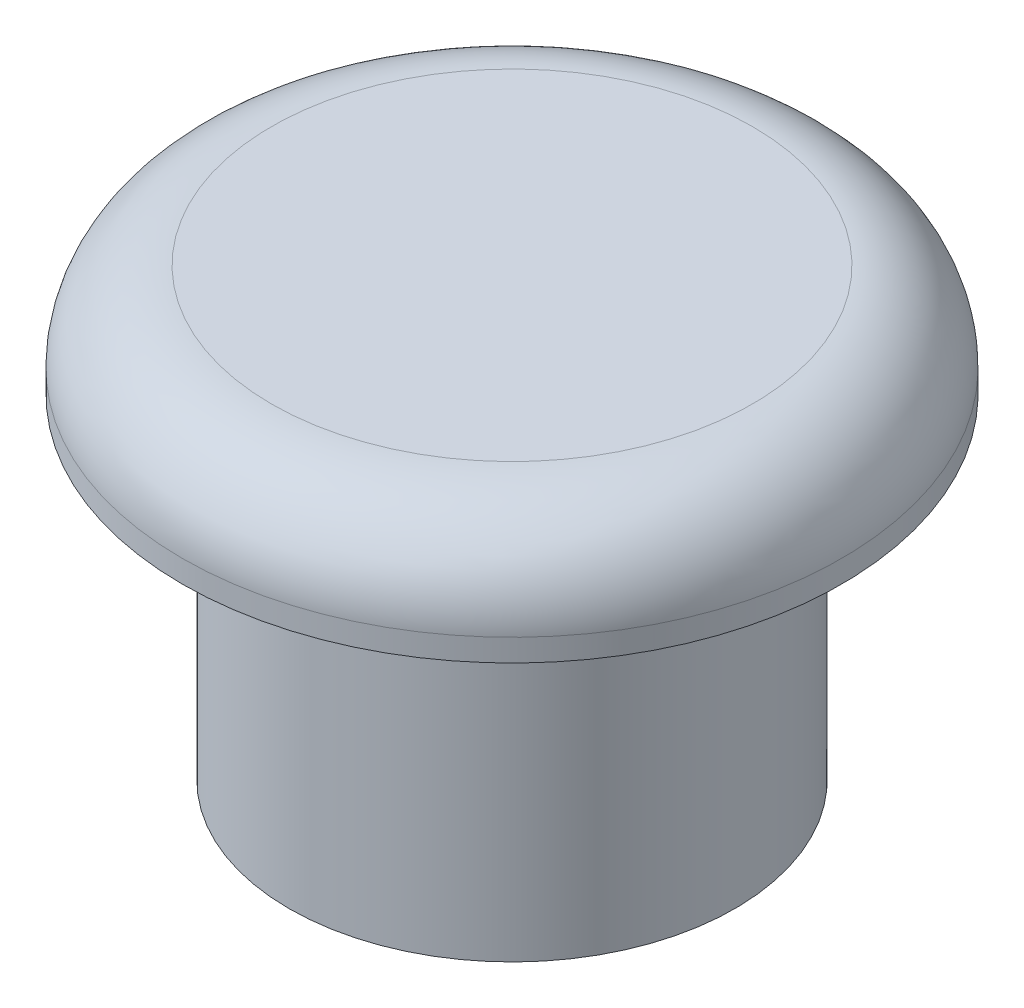
ISO-10303-21;
HEADER;
FILE_DESCRIPTION(('STEP AP214'),'2;1');
FILE_NAME('part.step','',(''),(''),'','','');
FILE_SCHEMA(('AUTOMOTIVE_DESIGN { 1 0 10303 214 1 1 1 1 }'));
ENDSEC;
DATA;
#1=APPLICATION_CONTEXT('core data for automotive mechanical design processes');
#2=APPLICATION_PROTOCOL_DEFINITION('international standard','automotive_design',2000,#1);
#3=PRODUCT_CONTEXT('',#1,'mechanical');
#4=PRODUCT('Part','Part','',(#3));
#5=PRODUCT_RELATED_PRODUCT_CATEGORY('part','',(#4));
#6=PRODUCT_DEFINITION_FORMATION('','',#4);
#7=PRODUCT_DEFINITION_CONTEXT('part definition',#1,'design');
#8=PRODUCT_DEFINITION('design','',#6,#7);
#9=PRODUCT_DEFINITION_SHAPE('','',#8);
#10=(LENGTH_UNIT() NAMED_UNIT(*) SI_UNIT(.MILLI.,.METRE.));
#11=(NAMED_UNIT(*) PLANE_ANGLE_UNIT() SI_UNIT($,.RADIAN.));
#12=(NAMED_UNIT(*) SI_UNIT($,.STERADIAN.) SOLID_ANGLE_UNIT());
#13=UNCERTAINTY_MEASURE_WITH_UNIT(LENGTH_MEASURE(1.E-05),#10,'distance_accuracy_value','');
#14=(GEOMETRIC_REPRESENTATION_CONTEXT(3) GLOBAL_UNCERTAINTY_ASSIGNED_CONTEXT((#13)) GLOBAL_UNIT_ASSIGNED_CONTEXT((#10,
#11,#12)) REPRESENTATION_CONTEXT('',''));
#15=CARTESIAN_POINT('',(0.,0.,0.));
#16=DIRECTION('',(0.,0.,1.));
#17=DIRECTION('',(1.,0.,0.));
#18=AXIS2_PLACEMENT_3D('',#15,#16,#17);
#19=CARTESIAN_POINT('',(0.,3.,0.));
#20=DIRECTION('',(0.,-1.,0.));
#21=DIRECTION('',(0.,0.,-1.));
#22=AXIS2_PLACEMENT_3D('',#19,#20,#21);
#23=CYLINDRICAL_SURFACE('',#22,2.);
#24=CARTESIAN_POINT('',(0.,3.,0.));
#25=DIRECTION('',(0.,1.,0.));
#26=DIRECTION('',(0.,0.,1.));
#27=AXIS2_PLACEMENT_3D('',#24,#25,#26);
#28=CIRCLE('',#27,2.);
#29=CARTESIAN_POINT('',(0.,3.,2.));
#30=VERTEX_POINT('',#29);
#31=EDGE_CURVE('E46',#30,#30,#28,.T.);
#32=ORIENTED_EDGE('',*,*,#31,.F.);
#33=EDGE_LOOP('',(#32));
#34=FACE_BOUND('',#33,.T.);
#35=CARTESIAN_POINT('',(0.,0.,0.));
#36=DIRECTION('',(0.,1.,0.));
#37=DIRECTION('',(0.,0.,1.));
#38=AXIS2_PLACEMENT_3D('',#35,#36,#37);
#39=CIRCLE('',#38,2.);
#40=CARTESIAN_POINT('',(0.,0.,2.));
#41=VERTEX_POINT('',#40);
#42=EDGE_CURVE('E50',#41,#41,#39,.T.);
#43=ORIENTED_EDGE('',*,*,#42,.T.);
#44=EDGE_LOOP('',(#43));
#45=FACE_BOUND('',#44,.T.);
#46=ADVANCED_FACE('F35',(#34,#45),#23,.T.);
#47=CARTESIAN_POINT('',(0.,0.,0.));
#48=DIRECTION('',(0.,1.,0.));
#49=DIRECTION('',(0.,0.,1.));
#50=AXIS2_PLACEMENT_3D('',#47,#48,#49);
#51=PLANE('',#50);
#52=ORIENTED_EDGE('',*,*,#42,.F.);
#53=EDGE_LOOP('',(#52));
#54=FACE_BOUND('',#53,.T.);
#55=ADVANCED_FACE('F76',(#54),#51,.F.);
#56=CARTESIAN_POINT('',(0.,4.,0.));
#57=DIRECTION('',(0.,-1.,0.));
#58=DIRECTION('',(0.,0.,-1.));
#59=AXIS2_PLACEMENT_3D('',#56,#57,#58);
#60=CYLINDRICAL_SURFACE('',#59,2.95734258773505);
#61=CARTESIAN_POINT('',(0.,3.2,0.));
#62=DIRECTION('',(0.,1.,0.));
#63=DIRECTION('',(0.,0.,1.));
#64=AXIS2_PLACEMENT_3D('',#61,#62,#63);
#65=CIRCLE('',#64,2.95734258773505);
#66=CARTESIAN_POINT('',(0.,3.2,2.95734258773505));
#67=VERTEX_POINT('',#66);
#68=EDGE_CURVE('E10',#67,#67,#65,.F.);
#69=ORIENTED_EDGE('',*,*,#68,.T.);
#70=EDGE_LOOP('',(#69));
#71=FACE_BOUND('',#70,.T.);
#72=CARTESIAN_POINT('',(0.,3.,0.));
#73=DIRECTION('',(0.,1.,0.));
#74=DIRECTION('',(0.,0.,1.));
#75=AXIS2_PLACEMENT_3D('',#72,#73,#74);
#76=CIRCLE('',#75,2.95734258773505);
#77=CARTESIAN_POINT('',(0.,3.,2.95734258773505));
#78=VERTEX_POINT('',#77);
#79=EDGE_CURVE('E54',#78,#78,#76,.T.);
#80=ORIENTED_EDGE('',*,*,#79,.T.);
#81=EDGE_LOOP('',(#80));
#82=FACE_BOUND('',#81,.T.);
#83=ADVANCED_FACE('F59',(#71,#82),#60,.T.);
#84=CARTESIAN_POINT('',(0.,4.,0.));
#85=DIRECTION('',(0.,1.,0.));
#86=DIRECTION('',(0.,0.,1.));
#87=AXIS2_PLACEMENT_3D('',#84,#85,#86);
#88=PLANE('',#87);
#89=CARTESIAN_POINT('',(0.,4.,0.));
#90=DIRECTION('',(0.,1.,0.));
#91=DIRECTION('',(0.,0.,1.));
#92=AXIS2_PLACEMENT_3D('',#89,#90,#91);
#93=CIRCLE('',#92,2.15734258773505);
#94=CARTESIAN_POINT('',(0.,4.,2.15734258773505));
#95=VERTEX_POINT('',#94);
#96=EDGE_CURVE('E42',#95,#95,#93,.T.);
#97=ORIENTED_EDGE('',*,*,#96,.T.);
#98=EDGE_LOOP('',(#97));
#99=FACE_BOUND('',#98,.T.);
#100=ADVANCED_FACE('F63',(#99),#88,.T.);
#101=CARTESIAN_POINT('',(0.,3.,0.));
#102=DIRECTION('',(0.,1.,0.));
#103=DIRECTION('',(0.,0.,1.));
#104=AXIS2_PLACEMENT_3D('',#101,#102,#103);
#105=PLANE('',#104);
#106=ORIENTED_EDGE('',*,*,#31,.T.);
#107=EDGE_LOOP('',(#106));
#108=FACE_BOUND('',#107,.T.);
#109=ORIENTED_EDGE('',*,*,#79,.F.);
#110=EDGE_LOOP('',(#109));
#111=FACE_BOUND('',#110,.T.);
#112=ADVANCED_FACE('F61',(#108,#111),#105,.F.);
#113=CARTESIAN_POINT('',(0.,3.2,0.));
#114=DIRECTION('',(0.,1.,0.));
#115=DIRECTION('',(0.,0.,1.));
#116=AXIS2_PLACEMENT_3D('',#113,#114,#115);
#117=TOROIDAL_SURFACE('',#116,2.15734258773505,0.8);
#118=ORIENTED_EDGE('',*,*,#68,.F.);
#119=EDGE_LOOP('',(#118));
#120=FACE_BOUND('',#119,.T.);
#121=ORIENTED_EDGE('',*,*,#96,.F.);
#122=EDGE_LOOP('',(#121));
#123=FACE_BOUND('',#122,.T.);
#124=ADVANCED_FACE('F37',(#120,#123),#117,.T.);
#125=CLOSED_SHELL('',(#46,#55,#83,#100,#112,#124));
#126=MANIFOLD_SOLID_BREP('B2',#125);
#127=ADVANCED_BREP_SHAPE_REPRESENTATION('',(#18,#126),#14);
#128=SHAPE_DEFINITION_REPRESENTATION(#9,#127);
ENDSEC;
END-ISO-10303-21;
